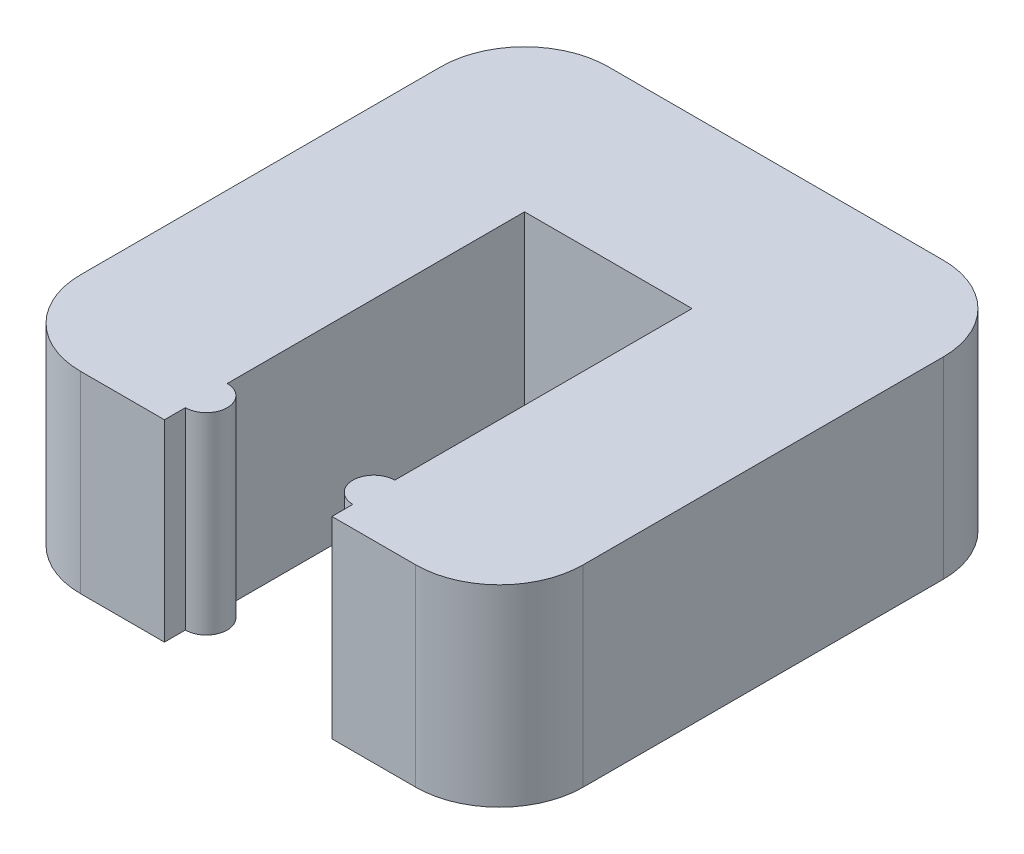
ISO-10303-21;
HEADER;
FILE_DESCRIPTION(('STEP AP214'),'2;1');
FILE_NAME('part.step','',(''),(''),'','','');
FILE_SCHEMA(('AUTOMOTIVE_DESIGN { 1 0 10303 214 1 1 1 1 }'));
ENDSEC;
DATA;
#1=APPLICATION_CONTEXT('core data for automotive mechanical design processes');
#2=APPLICATION_PROTOCOL_DEFINITION('international standard','automotive_design',2000,#1);
#3=PRODUCT_CONTEXT('',#1,'mechanical');
#4=PRODUCT('Part','Part','',(#3));
#5=PRODUCT_RELATED_PRODUCT_CATEGORY('part','',(#4));
#6=PRODUCT_DEFINITION_FORMATION('','',#4);
#7=PRODUCT_DEFINITION_CONTEXT('part definition',#1,'design');
#8=PRODUCT_DEFINITION('design','',#6,#7);
#9=PRODUCT_DEFINITION_SHAPE('','',#8);
#10=(LENGTH_UNIT() NAMED_UNIT(*) SI_UNIT(.MILLI.,.METRE.));
#11=(NAMED_UNIT(*) PLANE_ANGLE_UNIT() SI_UNIT($,.RADIAN.));
#12=(NAMED_UNIT(*) SI_UNIT($,.STERADIAN.) SOLID_ANGLE_UNIT());
#13=UNCERTAINTY_MEASURE_WITH_UNIT(LENGTH_MEASURE(1.E-05),#10,'distance_accuracy_value','');
#14=(GEOMETRIC_REPRESENTATION_CONTEXT(3) GLOBAL_UNCERTAINTY_ASSIGNED_CONTEXT((#13)) GLOBAL_UNIT_ASSIGNED_CONTEXT((#10,
#11,#12)) REPRESENTATION_CONTEXT('',''));
#15=CARTESIAN_POINT('',(0.,0.,0.));
#16=DIRECTION('',(0.,0.,1.));
#17=DIRECTION('',(1.,0.,0.));
#18=AXIS2_PLACEMENT_3D('',#15,#16,#17);
#19=CARTESIAN_POINT('',(1.,-2.3,2.15));
#20=DIRECTION('',(-1.,0.,0.));
#21=DIRECTION('',(0.,0.,1.));
#22=AXIS2_PLACEMENT_3D('',#19,#20,#21);
#23=PLANE('',#22);
#24=DIRECTION('',(0.,1.,0.));
#25=VECTOR('',#24,1.);
#26=CARTESIAN_POINT('',(1.,-2.3,1.9));
#27=LINE('',#26,#25);
#28=CARTESIAN_POINT('',(1.,-2.3,1.9));
#29=VERTEX_POINT('',#28);
#30=CARTESIAN_POINT('',(1.,0.,1.9));
#31=VERTEX_POINT('',#30);
#32=EDGE_CURVE('E151',#29,#31,#27,.T.);
#33=ORIENTED_EDGE('',*,*,#32,.F.);
#34=DIRECTION('',(0.,0.,1.));
#35=VECTOR('',#34,1.);
#36=CARTESIAN_POINT('',(1.,-2.3,2.15));
#37=LINE('',#36,#35);
#38=CARTESIAN_POINT('',(1.,-2.3,2.15));
#39=VERTEX_POINT('',#38);
#40=EDGE_CURVE('E162',#29,#39,#37,.T.);
#41=ORIENTED_EDGE('',*,*,#40,.T.);
#42=DIRECTION('',(0.,1.,0.));
#43=VECTOR('',#42,1.);
#44=CARTESIAN_POINT('',(1.,-2.3,2.15));
#45=LINE('',#44,#43);
#46=CARTESIAN_POINT('',(1.,0.,2.15));
#47=VERTEX_POINT('',#46);
#48=EDGE_CURVE('E40',#39,#47,#45,.T.);
#49=ORIENTED_EDGE('',*,*,#48,.T.);
#50=DIRECTION('',(0.,0.,1.));
#51=VECTOR('',#50,1.);
#52=CARTESIAN_POINT('',(1.,0.,2.15));
#53=LINE('',#52,#51);
#54=EDGE_CURVE('E164',#31,#47,#53,.T.);
#55=ORIENTED_EDGE('',*,*,#54,.F.);
#56=EDGE_LOOP('',(#33,#41,#49,#55));
#57=FACE_BOUND('',#56,.T.);
#58=ADVANCED_FACE('F36',(#57),#23,.T.);
#59=CARTESIAN_POINT('',(-1.,-2.3,2.15));
#60=DIRECTION('',(1.,0.,0.));
#61=DIRECTION('',(0.,0.,-1.));
#62=AXIS2_PLACEMENT_3D('',#59,#60,#61);
#63=PLANE('',#62);
#64=DIRECTION('',(0.,1.,0.));
#65=VECTOR('',#64,1.);
#66=CARTESIAN_POINT('',(-1.,-2.3,1.4));
#67=LINE('',#66,#65);
#68=CARTESIAN_POINT('',(-1.,-2.3,1.4));
#69=VERTEX_POINT('',#68);
#70=CARTESIAN_POINT('',(-1.,0.,1.4));
#71=VERTEX_POINT('',#70);
#72=EDGE_CURVE('E179',#69,#71,#67,.T.);
#73=ORIENTED_EDGE('',*,*,#72,.F.);
#74=DIRECTION('',(0.,0.,-1.));
#75=VECTOR('',#74,1.);
#76=CARTESIAN_POINT('',(-1.,-2.3,2.15));
#77=LINE('',#76,#75);
#78=CARTESIAN_POINT('',(-1.,-2.3,-2.15));
#79=VERTEX_POINT('',#78);
#80=EDGE_CURVE('E206',#69,#79,#77,.T.);
#81=ORIENTED_EDGE('',*,*,#80,.T.);
#82=DIRECTION('',(0.,1.,0.));
#83=VECTOR('',#82,1.);
#84=CARTESIAN_POINT('',(-1.,-2.3,-2.15));
#85=LINE('',#84,#83);
#86=CARTESIAN_POINT('',(-1.,0.,-2.15));
#87=VERTEX_POINT('',#86);
#88=EDGE_CURVE('E45',#79,#87,#85,.T.);
#89=ORIENTED_EDGE('',*,*,#88,.T.);
#90=DIRECTION('',(0.,0.,-1.));
#91=VECTOR('',#90,1.);
#92=CARTESIAN_POINT('',(-1.,0.,2.15));
#93=LINE('',#92,#91);
#94=EDGE_CURVE('E242',#71,#87,#93,.T.);
#95=ORIENTED_EDGE('',*,*,#94,.F.);
#96=EDGE_LOOP('',(#73,#81,#89,#95));
#97=FACE_BOUND('',#96,.T.);
#98=ADVANCED_FACE('F289',(#97),#63,.T.);
#99=DIRECTION('',(0.,1.,0.));
#100=VECTOR('',#99,1.);
#101=CARTESIAN_POINT('',(1.,-2.3,1.4));
#102=LINE('',#101,#100);
#103=CARTESIAN_POINT('',(1.,-2.3,1.4));
#104=VERTEX_POINT('',#103);
#105=CARTESIAN_POINT('',(1.,0.,1.4));
#106=VERTEX_POINT('',#105);
#107=EDGE_CURVE('E154',#104,#106,#102,.T.);
#108=ORIENTED_EDGE('',*,*,#107,.T.);
#109=CARTESIAN_POINT('',(1.,0.,-2.15));
#110=VERTEX_POINT('',#109);
#111=EDGE_CURVE('E213',#110,#106,#53,.T.);
#112=ORIENTED_EDGE('',*,*,#111,.F.);
#113=DIRECTION('',(0.,1.,0.));
#114=VECTOR('',#113,1.);
#115=CARTESIAN_POINT('',(1.,-2.3,-2.15));
#116=LINE('',#115,#114);
#117=CARTESIAN_POINT('',(1.,-2.3,-2.15));
#118=VERTEX_POINT('',#117);
#119=EDGE_CURVE('E11',#118,#110,#116,.T.);
#120=ORIENTED_EDGE('',*,*,#119,.F.);
#121=EDGE_CURVE('E171',#118,#104,#37,.T.);
#122=ORIENTED_EDGE('',*,*,#121,.T.);
#123=EDGE_LOOP('',(#108,#112,#120,#122));
#124=FACE_BOUND('',#123,.T.);
#125=ADVANCED_FACE('F38',(#124),#23,.T.);
#126=CARTESIAN_POINT('',(-1.,-2.3,-2.15));
#127=DIRECTION('',(0.,0.,1.));
#128=DIRECTION('',(1.,0.,0.));
#129=AXIS2_PLACEMENT_3D('',#126,#127,#128);
#130=PLANE('',#129);
#131=DIRECTION('',(1.,0.,0.));
#132=VECTOR('',#131,1.);
#133=CARTESIAN_POINT('',(-1.,0.,-2.15));
#134=LINE('',#133,#132);
#135=EDGE_CURVE('E172',#87,#110,#134,.T.);
#136=ORIENTED_EDGE('',*,*,#135,.F.);
#137=ORIENTED_EDGE('',*,*,#88,.F.);
#138=DIRECTION('',(1.,0.,0.));
#139=VECTOR('',#138,1.);
#140=CARTESIAN_POINT('',(-1.,-2.3,-2.15));
#141=LINE('',#140,#139);
#142=EDGE_CURVE('E210',#79,#118,#141,.T.);
#143=ORIENTED_EDGE('',*,*,#142,.T.);
#144=ORIENTED_EDGE('',*,*,#119,.T.);
#145=EDGE_LOOP('',(#136,#137,#143,#144));
#146=FACE_BOUND('',#145,.T.);
#147=ADVANCED_FACE('F282',(#146),#130,.T.);
#148=DIRECTION('',(0.,1.,0.));
#149=VECTOR('',#148,1.);
#150=CARTESIAN_POINT('',(-1.,-2.3,1.9));
#151=LINE('',#150,#149);
#152=CARTESIAN_POINT('',(-1.,-2.3,1.9));
#153=VERTEX_POINT('',#152);
#154=CARTESIAN_POINT('',(-1.,0.,1.9));
#155=VERTEX_POINT('',#154);
#156=EDGE_CURVE('E267',#153,#155,#151,.T.);
#157=ORIENTED_EDGE('',*,*,#156,.T.);
#158=CARTESIAN_POINT('',(-1.,0.,2.15));
#159=VERTEX_POINT('',#158);
#160=EDGE_CURVE('E175',#159,#155,#93,.T.);
#161=ORIENTED_EDGE('',*,*,#160,.F.);
#162=DIRECTION('',(0.,1.,0.));
#163=VECTOR('',#162,1.);
#164=CARTESIAN_POINT('',(-1.,-2.3,2.15));
#165=LINE('',#164,#163);
#166=CARTESIAN_POINT('',(-1.,-2.3,2.15));
#167=VERTEX_POINT('',#166);
#168=EDGE_CURVE('E246',#167,#159,#165,.T.);
#169=ORIENTED_EDGE('',*,*,#168,.F.);
#170=EDGE_CURVE('E207',#167,#153,#77,.T.);
#171=ORIENTED_EDGE('',*,*,#170,.T.);
#172=EDGE_LOOP('',(#157,#161,#169,#171));
#173=FACE_BOUND('',#172,.T.);
#174=ADVANCED_FACE('F307',(#173),#63,.T.);
#175=CARTESIAN_POINT('',(-1.,-2.3,2.15));
#176=DIRECTION('',(0.,0.,1.));
#177=DIRECTION('',(1.,0.,0.));
#178=AXIS2_PLACEMENT_3D('',#175,#176,#177);
#179=PLANE('',#178);
#180=DIRECTION('',(1.,0.,0.));
#181=VECTOR('',#180,1.);
#182=CARTESIAN_POINT('',(-1.,0.,2.15));
#183=LINE('',#182,#181);
#184=CARTESIAN_POINT('',(-1.99999999999999,0.,2.15));
#185=VERTEX_POINT('',#184);
#186=EDGE_CURVE('E239',#185,#159,#183,.T.);
#187=ORIENTED_EDGE('',*,*,#186,.F.);
#188=DIRECTION('',(0.,1.,0.));
#189=VECTOR('',#188,1.);
#190=CARTESIAN_POINT('',(-1.99999999999999,-2.3,2.15));
#191=LINE('',#190,#189);
#192=CARTESIAN_POINT('',(-1.99999999999999,-2.3,2.15));
#193=VERTEX_POINT('',#192);
#194=EDGE_CURVE('E248',#193,#185,#191,.T.);
#195=ORIENTED_EDGE('',*,*,#194,.F.);
#196=DIRECTION('',(1.,0.,0.));
#197=VECTOR('',#196,1.);
#198=CARTESIAN_POINT('',(-1.,-2.3,2.15));
#199=LINE('',#198,#197);
#200=EDGE_CURVE('E203',#193,#167,#199,.T.);
#201=ORIENTED_EDGE('',*,*,#200,.T.);
#202=ORIENTED_EDGE('',*,*,#168,.T.);
#203=EDGE_LOOP('',(#187,#195,#201,#202));
#204=FACE_BOUND('',#203,.T.);
#205=ADVANCED_FACE('F317',(#204),#179,.T.);
#206=CARTESIAN_POINT('',(-2.,-2.3,1.15));
#207=DIRECTION('',(0.,1.,0.));
#208=DIRECTION('',(0.,0.,1.));
#209=AXIS2_PLACEMENT_3D('',#206,#207,#208);
#210=CYLINDRICAL_SURFACE('',#209,1.);
#211=CARTESIAN_POINT('',(-2.,0.,1.15));
#212=DIRECTION('',(0.,1.,0.));
#213=DIRECTION('',(0.,0.,-1.));
#214=AXIS2_PLACEMENT_3D('',#211,#212,#213);
#215=CIRCLE('',#214,1.);
#216=CARTESIAN_POINT('',(-3.,0.,1.14999999999999));
#217=VERTEX_POINT('',#216);
#218=EDGE_CURVE('E236',#217,#185,#215,.T.);
#219=ORIENTED_EDGE('',*,*,#218,.F.);
#220=DIRECTION('',(0.,1.,0.));
#221=VECTOR('',#220,1.);
#222=CARTESIAN_POINT('',(-3.,-2.3,1.14999999999999));
#223=LINE('',#222,#221);
#224=CARTESIAN_POINT('',(-3.,-2.3,1.14999999999999));
#225=VERTEX_POINT('',#224);
#226=EDGE_CURVE('E250',#225,#217,#223,.T.);
#227=ORIENTED_EDGE('',*,*,#226,.F.);
#228=CARTESIAN_POINT('',(-2.,-2.3,1.15));
#229=DIRECTION('',(0.,1.,0.));
#230=DIRECTION('',(0.,0.,-1.));
#231=AXIS2_PLACEMENT_3D('',#228,#229,#230);
#232=CIRCLE('',#231,1.);
#233=EDGE_CURVE('E200',#225,#193,#232,.T.);
#234=ORIENTED_EDGE('',*,*,#233,.T.);
#235=ORIENTED_EDGE('',*,*,#194,.T.);
#236=EDGE_LOOP('',(#219,#227,#234,#235));
#237=FACE_BOUND('',#236,.T.);
#238=ADVANCED_FACE('F321',(#237),#210,.T.);
#239=CARTESIAN_POINT('',(-3.,-2.3,1.14999999999999));
#240=DIRECTION('',(-1.,0.,0.));
#241=DIRECTION('',(0.,0.,1.));
#242=AXIS2_PLACEMENT_3D('',#239,#240,#241);
#243=PLANE('',#242);
#244=DIRECTION('',(0.,0.,1.));
#245=VECTOR('',#244,1.);
#246=CARTESIAN_POINT('',(-3.,0.,1.14999999999999));
#247=LINE('',#246,#245);
#248=CARTESIAN_POINT('',(-3.,0.,-3.14999999999999));
#249=VERTEX_POINT('',#248);
#250=EDGE_CURVE('E233',#249,#217,#247,.T.);
#251=ORIENTED_EDGE('',*,*,#250,.F.);
#252=DIRECTION('',(0.,1.,0.));
#253=VECTOR('',#252,1.);
#254=CARTESIAN_POINT('',(-3.,-2.3,-3.14999999999999));
#255=LINE('',#254,#253);
#256=CARTESIAN_POINT('',(-3.,-2.3,-3.14999999999999));
#257=VERTEX_POINT('',#256);
#258=EDGE_CURVE('E252',#257,#249,#255,.T.);
#259=ORIENTED_EDGE('',*,*,#258,.F.);
#260=DIRECTION('',(0.,0.,1.));
#261=VECTOR('',#260,1.);
#262=CARTESIAN_POINT('',(-3.,-2.3,1.14999999999999));
#263=LINE('',#262,#261);
#264=EDGE_CURVE('E197',#257,#225,#263,.T.);
#265=ORIENTED_EDGE('',*,*,#264,.T.);
#266=ORIENTED_EDGE('',*,*,#226,.T.);
#267=EDGE_LOOP('',(#251,#259,#265,#266));
#268=FACE_BOUND('',#267,.T.);
#269=ADVANCED_FACE('F325',(#268),#243,.T.);
#270=CARTESIAN_POINT('',(-2.,-2.3,-3.15));
#271=DIRECTION('',(0.,1.,0.));
#272=DIRECTION('',(0.,0.,1.));
#273=AXIS2_PLACEMENT_3D('',#270,#271,#272);
#274=CYLINDRICAL_SURFACE('',#273,1.);
#275=CARTESIAN_POINT('',(-2.,0.,-3.15));
#276=DIRECTION('',(0.,1.,0.));
#277=DIRECTION('',(0.,0.,-1.));
#278=AXIS2_PLACEMENT_3D('',#275,#276,#277);
#279=CIRCLE('',#278,1.);
#280=CARTESIAN_POINT('',(-2.,0.,-4.15));
#281=VERTEX_POINT('',#280);
#282=EDGE_CURVE('E230',#281,#249,#279,.T.);
#283=ORIENTED_EDGE('',*,*,#282,.F.);
#284=DIRECTION('',(0.,1.,0.));
#285=VECTOR('',#284,1.);
#286=CARTESIAN_POINT('',(-2.,-2.3,-4.15));
#287=LINE('',#286,#285);
#288=CARTESIAN_POINT('',(-2.,-2.3,-4.15));
#289=VERTEX_POINT('',#288);
#290=EDGE_CURVE('E254',#289,#281,#287,.T.);
#291=ORIENTED_EDGE('',*,*,#290,.F.);
#292=CARTESIAN_POINT('',(-2.,-2.3,-3.15));
#293=DIRECTION('',(0.,1.,0.));
#294=DIRECTION('',(0.,0.,-1.));
#295=AXIS2_PLACEMENT_3D('',#292,#293,#294);
#296=CIRCLE('',#295,1.);
#297=EDGE_CURVE('E194',#289,#257,#296,.T.);
#298=ORIENTED_EDGE('',*,*,#297,.T.);
#299=ORIENTED_EDGE('',*,*,#258,.T.);
#300=EDGE_LOOP('',(#283,#291,#298,#299));
#301=FACE_BOUND('',#300,.T.);
#302=ADVANCED_FACE('F329',(#301),#274,.T.);
#303=CARTESIAN_POINT('',(-1.99999999999999,-2.3,-4.15));
#304=DIRECTION('',(0.,0.,-1.));
#305=DIRECTION('',(-1.,0.,0.));
#306=AXIS2_PLACEMENT_3D('',#303,#304,#305);
#307=PLANE('',#306);
#308=DIRECTION('',(-1.,0.,0.));
#309=VECTOR('',#308,1.);
#310=CARTESIAN_POINT('',(-1.99999999999999,0.,-4.15));
#311=LINE('',#310,#309);
#312=CARTESIAN_POINT('',(1.99999999999999,0.,-4.15));
#313=VERTEX_POINT('',#312);
#314=EDGE_CURVE('E227',#313,#281,#311,.T.);
#315=ORIENTED_EDGE('',*,*,#314,.F.);
#316=DIRECTION('',(0.,1.,0.));
#317=VECTOR('',#316,1.);
#318=CARTESIAN_POINT('',(1.99999999999999,-2.3,-4.15));
#319=LINE('',#318,#317);
#320=CARTESIAN_POINT('',(1.99999999999999,-2.3,-4.15));
#321=VERTEX_POINT('',#320);
#322=EDGE_CURVE('E256',#321,#313,#319,.T.);
#323=ORIENTED_EDGE('',*,*,#322,.F.);
#324=DIRECTION('',(-1.,0.,0.));
#325=VECTOR('',#324,1.);
#326=CARTESIAN_POINT('',(-1.99999999999999,-2.3,-4.15));
#327=LINE('',#326,#325);
#328=EDGE_CURVE('E191',#321,#289,#327,.T.);
#329=ORIENTED_EDGE('',*,*,#328,.T.);
#330=ORIENTED_EDGE('',*,*,#290,.T.);
#331=EDGE_LOOP('',(#315,#323,#329,#330));
#332=FACE_BOUND('',#331,.T.);
#333=ADVANCED_FACE('F333',(#332),#307,.T.);
#334=CARTESIAN_POINT('',(2.,-2.3,-3.15));
#335=DIRECTION('',(0.,1.,0.));
#336=DIRECTION('',(0.,0.,1.));
#337=AXIS2_PLACEMENT_3D('',#334,#335,#336);
#338=CYLINDRICAL_SURFACE('',#337,1.);
#339=CARTESIAN_POINT('',(2.,0.,-3.15));
#340=DIRECTION('',(0.,1.,0.));
#341=DIRECTION('',(0.,0.,-1.));
#342=AXIS2_PLACEMENT_3D('',#339,#340,#341);
#343=CIRCLE('',#342,1.);
#344=CARTESIAN_POINT('',(3.,0.,-3.14999999999999));
#345=VERTEX_POINT('',#344);
#346=EDGE_CURVE('E224',#345,#313,#343,.T.);
#347=ORIENTED_EDGE('',*,*,#346,.F.);
#348=DIRECTION('',(0.,1.,0.));
#349=VECTOR('',#348,1.);
#350=CARTESIAN_POINT('',(3.,-2.3,-3.14999999999999));
#351=LINE('',#350,#349);
#352=CARTESIAN_POINT('',(3.,-2.3,-3.14999999999999));
#353=VERTEX_POINT('',#352);
#354=EDGE_CURVE('E258',#353,#345,#351,.T.);
#355=ORIENTED_EDGE('',*,*,#354,.F.);
#356=CARTESIAN_POINT('',(2.,-2.3,-3.15));
#357=DIRECTION('',(0.,1.,0.));
#358=DIRECTION('',(0.,0.,-1.));
#359=AXIS2_PLACEMENT_3D('',#356,#357,#358);
#360=CIRCLE('',#359,1.);
#361=EDGE_CURVE('E188',#353,#321,#360,.T.);
#362=ORIENTED_EDGE('',*,*,#361,.T.);
#363=ORIENTED_EDGE('',*,*,#322,.T.);
#364=EDGE_LOOP('',(#347,#355,#362,#363));
#365=FACE_BOUND('',#364,.T.);
#366=ADVANCED_FACE('F337',(#365),#338,.T.);
#367=CARTESIAN_POINT('',(3.,-2.3,-3.14999999999999));
#368=DIRECTION('',(1.,0.,0.));
#369=DIRECTION('',(0.,0.,-1.));
#370=AXIS2_PLACEMENT_3D('',#367,#368,#369);
#371=PLANE('',#370);
#372=DIRECTION('',(0.,0.,-1.));
#373=VECTOR('',#372,1.);
#374=CARTESIAN_POINT('',(3.,0.,-3.14999999999999));
#375=LINE('',#374,#373);
#376=CARTESIAN_POINT('',(3.,0.,1.14999999999999));
#377=VERTEX_POINT('',#376);
#378=EDGE_CURVE('E221',#377,#345,#375,.T.);
#379=ORIENTED_EDGE('',*,*,#378,.F.);
#380=DIRECTION('',(0.,1.,0.));
#381=VECTOR('',#380,1.);
#382=CARTESIAN_POINT('',(3.,-2.3,1.14999999999999));
#383=LINE('',#382,#381);
#384=CARTESIAN_POINT('',(3.,-2.3,1.14999999999999));
#385=VERTEX_POINT('',#384);
#386=EDGE_CURVE('E260',#385,#377,#383,.T.);
#387=ORIENTED_EDGE('',*,*,#386,.F.);
#388=DIRECTION('',(0.,0.,-1.));
#389=VECTOR('',#388,1.);
#390=CARTESIAN_POINT('',(3.,-2.3,-3.14999999999999));
#391=LINE('',#390,#389);
#392=EDGE_CURVE('E185',#385,#353,#391,.T.);
#393=ORIENTED_EDGE('',*,*,#392,.T.);
#394=ORIENTED_EDGE('',*,*,#354,.T.);
#395=EDGE_LOOP('',(#379,#387,#393,#394));
#396=FACE_BOUND('',#395,.T.);
#397=ADVANCED_FACE('F341',(#396),#371,.T.);
#398=CARTESIAN_POINT('',(2.,-2.3,1.15));
#399=DIRECTION('',(0.,1.,0.));
#400=DIRECTION('',(0.,0.,1.));
#401=AXIS2_PLACEMENT_3D('',#398,#399,#400);
#402=CYLINDRICAL_SURFACE('',#401,1.);
#403=CARTESIAN_POINT('',(2.,0.,1.15));
#404=DIRECTION('',(0.,1.,0.));
#405=DIRECTION('',(0.,0.,-1.));
#406=AXIS2_PLACEMENT_3D('',#403,#404,#405);
#407=CIRCLE('',#406,1.);
#408=CARTESIAN_POINT('',(1.99999999999999,0.,2.15));
#409=VERTEX_POINT('',#408);
#410=EDGE_CURVE('E218',#409,#377,#407,.T.);
#411=ORIENTED_EDGE('',*,*,#410,.F.);
#412=DIRECTION('',(0.,1.,0.));
#413=VECTOR('',#412,1.);
#414=CARTESIAN_POINT('',(1.99999999999999,-2.3,2.15));
#415=LINE('',#414,#413);
#416=CARTESIAN_POINT('',(1.99999999999999,-2.3,2.15));
#417=VERTEX_POINT('',#416);
#418=EDGE_CURVE('E261',#417,#409,#415,.T.);
#419=ORIENTED_EDGE('',*,*,#418,.F.);
#420=CARTESIAN_POINT('',(2.,-2.3,1.15));
#421=DIRECTION('',(0.,1.,0.));
#422=DIRECTION('',(0.,0.,-1.));
#423=AXIS2_PLACEMENT_3D('',#420,#421,#422);
#424=CIRCLE('',#423,1.);
#425=EDGE_CURVE('E182',#417,#385,#424,.T.);
#426=ORIENTED_EDGE('',*,*,#425,.T.);
#427=ORIENTED_EDGE('',*,*,#386,.T.);
#428=EDGE_LOOP('',(#411,#419,#426,#427));
#429=FACE_BOUND('',#428,.T.);
#430=ADVANCED_FACE('F345',(#429),#402,.T.);
#431=CARTESIAN_POINT('',(1.99999999999999,-2.3,2.15));
#432=DIRECTION('',(0.,0.,1.));
#433=DIRECTION('',(1.,0.,0.));
#434=AXIS2_PLACEMENT_3D('',#431,#432,#433);
#435=PLANE('',#434);
#436=DIRECTION('',(1.,0.,0.));
#437=VECTOR('',#436,1.);
#438=CARTESIAN_POINT('',(1.99999999999999,0.,2.15));
#439=LINE('',#438,#437);
#440=EDGE_CURVE('E215',#47,#409,#439,.T.);
#441=ORIENTED_EDGE('',*,*,#440,.F.);
#442=ORIENTED_EDGE('',*,*,#48,.F.);
#443=DIRECTION('',(1.,0.,0.));
#444=VECTOR('',#443,1.);
#445=CARTESIAN_POINT('',(1.99999999999999,-2.3,2.15));
#446=LINE('',#445,#444);
#447=EDGE_CURVE('E170',#39,#417,#446,.T.);
#448=ORIENTED_EDGE('',*,*,#447,.T.);
#449=ORIENTED_EDGE('',*,*,#418,.T.);
#450=EDGE_LOOP('',(#441,#442,#448,#449));
#451=FACE_BOUND('',#450,.T.);
#452=ADVANCED_FACE('F265',(#451),#435,.T.);
#453=CARTESIAN_POINT('',(-2.,-2.3,1.15));
#454=DIRECTION('',(0.,-1.,0.));
#455=DIRECTION('',(0.,0.,-1.));
#456=AXIS2_PLACEMENT_3D('',#453,#454,#455);
#457=PLANE('',#456);
#458=ORIENTED_EDGE('',*,*,#121,.F.);
#459=ORIENTED_EDGE('',*,*,#142,.F.);
#460=ORIENTED_EDGE('',*,*,#80,.F.);
#461=CARTESIAN_POINT('',(-1.,-2.3,1.65));
#462=DIRECTION('',(0.,1.,0.));
#463=DIRECTION('',(0.,0.,-1.));
#464=AXIS2_PLACEMENT_3D('',#461,#462,#463);
#465=CIRCLE('',#464,0.25);
#466=EDGE_CURVE('E271',#153,#69,#465,.T.);
#467=ORIENTED_EDGE('',*,*,#466,.F.);
#468=ORIENTED_EDGE('',*,*,#170,.F.);
#469=ORIENTED_EDGE('',*,*,#200,.F.);
#470=ORIENTED_EDGE('',*,*,#233,.F.);
#471=ORIENTED_EDGE('',*,*,#264,.F.);
#472=ORIENTED_EDGE('',*,*,#297,.F.);
#473=ORIENTED_EDGE('',*,*,#328,.F.);
#474=ORIENTED_EDGE('',*,*,#361,.F.);
#475=ORIENTED_EDGE('',*,*,#392,.F.);
#476=ORIENTED_EDGE('',*,*,#425,.F.);
#477=ORIENTED_EDGE('',*,*,#447,.F.);
#478=ORIENTED_EDGE('',*,*,#40,.F.);
#479=CARTESIAN_POINT('',(1.,-2.3,1.65));
#480=DIRECTION('',(0.,1.,0.));
#481=DIRECTION('',(0.,0.,1.));
#482=AXIS2_PLACEMENT_3D('',#479,#480,#481);
#483=CIRCLE('',#482,0.25);
#484=EDGE_CURVE('E148',#104,#29,#483,.T.);
#485=ORIENTED_EDGE('',*,*,#484,.F.);
#486=EDGE_LOOP('',(#458,#459,#460,#467,#468,#469,#470,#471,#472,#473,#474,#475,#476,#477,#478,#485));
#487=FACE_BOUND('',#486,.T.);
#488=ADVANCED_FACE('F167',(#487),#457,.T.);
#489=CARTESIAN_POINT('',(-2.,0.,1.15));
#490=DIRECTION('',(0.,-1.,0.));
#491=DIRECTION('',(0.,0.,-1.));
#492=AXIS2_PLACEMENT_3D('',#489,#490,#491);
#493=PLANE('',#492);
#494=ORIENTED_EDGE('',*,*,#111,.T.);
#495=CARTESIAN_POINT('',(1.,0.,1.65));
#496=DIRECTION('',(0.,1.,0.));
#497=DIRECTION('',(0.,0.,1.));
#498=AXIS2_PLACEMENT_3D('',#495,#496,#497);
#499=CIRCLE('',#498,0.25);
#500=EDGE_CURVE('E53',#106,#31,#499,.T.);
#501=ORIENTED_EDGE('',*,*,#500,.T.);
#502=ORIENTED_EDGE('',*,*,#54,.T.);
#503=ORIENTED_EDGE('',*,*,#440,.T.);
#504=ORIENTED_EDGE('',*,*,#410,.T.);
#505=ORIENTED_EDGE('',*,*,#378,.T.);
#506=ORIENTED_EDGE('',*,*,#346,.T.);
#507=ORIENTED_EDGE('',*,*,#314,.T.);
#508=ORIENTED_EDGE('',*,*,#282,.T.);
#509=ORIENTED_EDGE('',*,*,#250,.T.);
#510=ORIENTED_EDGE('',*,*,#218,.T.);
#511=ORIENTED_EDGE('',*,*,#186,.T.);
#512=ORIENTED_EDGE('',*,*,#160,.T.);
#513=CARTESIAN_POINT('',(-1.,0.,1.65));
#514=DIRECTION('',(0.,1.,0.));
#515=DIRECTION('',(0.,0.,-1.));
#516=AXIS2_PLACEMENT_3D('',#513,#514,#515);
#517=CIRCLE('',#516,0.25);
#518=EDGE_CURVE('E60',#155,#71,#517,.T.);
#519=ORIENTED_EDGE('',*,*,#518,.T.);
#520=ORIENTED_EDGE('',*,*,#94,.T.);
#521=ORIENTED_EDGE('',*,*,#135,.T.);
#522=EDGE_LOOP('',(#494,#501,#502,#503,#504,#505,#506,#507,#508,#509,#510,#511,#512,#519,#520,#521));
#523=FACE_BOUND('',#522,.T.);
#524=ADVANCED_FACE('F266',(#523),#493,.F.);
#525=CARTESIAN_POINT('',(-1.,-2.3,1.65));
#526=DIRECTION('',(0.,1.,0.));
#527=DIRECTION('',(0.,0.,1.));
#528=AXIS2_PLACEMENT_3D('',#525,#526,#527);
#529=CYLINDRICAL_SURFACE('',#528,0.25);
#530=ORIENTED_EDGE('',*,*,#518,.F.);
#531=ORIENTED_EDGE('',*,*,#156,.F.);
#532=ORIENTED_EDGE('',*,*,#466,.T.);
#533=ORIENTED_EDGE('',*,*,#72,.T.);
#534=EDGE_LOOP('',(#530,#531,#532,#533));
#535=FACE_BOUND('',#534,.T.);
#536=ADVANCED_FACE('F291',(#535),#529,.T.);
#537=CARTESIAN_POINT('',(1.,-2.3,1.65));
#538=DIRECTION('',(0.,1.,0.));
#539=DIRECTION('',(0.,0.,1.));
#540=AXIS2_PLACEMENT_3D('',#537,#538,#539);
#541=CYLINDRICAL_SURFACE('',#540,0.25);
#542=ORIENTED_EDGE('',*,*,#500,.F.);
#543=ORIENTED_EDGE('',*,*,#107,.F.);
#544=ORIENTED_EDGE('',*,*,#484,.T.);
#545=ORIENTED_EDGE('',*,*,#32,.T.);
#546=EDGE_LOOP('',(#542,#543,#544,#545));
#547=FACE_BOUND('',#546,.T.);
#548=ADVANCED_FACE('F150',(#547),#541,.T.);
#549=CLOSED_SHELL('',(#58,#98,#125,#147,#174,#205,#238,#269,#302,#333,#366,#397,#430,#452,#488,
#524,#536,#548));
#550=MANIFOLD_SOLID_BREP('B2',#549);
#551=ADVANCED_BREP_SHAPE_REPRESENTATION('',(#18,#550),#14);
#552=SHAPE_DEFINITION_REPRESENTATION(#9,#551);
ENDSEC;
END-ISO-10303-21;
